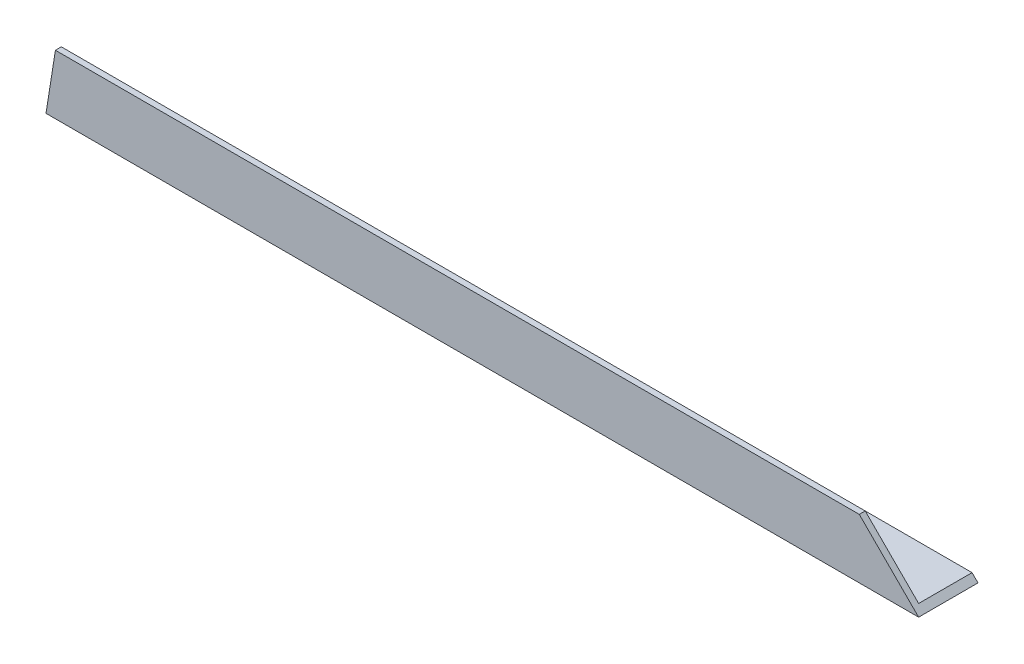
ISO-10303-21;
HEADER;
FILE_DESCRIPTION(('STEP AP214'),'2;1');
FILE_NAME('part.step','',(''),(''),'','','');
FILE_SCHEMA(('AUTOMOTIVE_DESIGN { 1 0 10303 214 1 1 1 1 }'));
ENDSEC;
DATA;
#1=APPLICATION_CONTEXT('core data for automotive mechanical design processes');
#2=APPLICATION_PROTOCOL_DEFINITION('international standard','automotive_design',2000,#1);
#3=PRODUCT_CONTEXT('',#1,'mechanical');
#4=PRODUCT('Part','Part','',(#3));
#5=PRODUCT_RELATED_PRODUCT_CATEGORY('part','',(#4));
#6=PRODUCT_DEFINITION_FORMATION('','',#4);
#7=PRODUCT_DEFINITION_CONTEXT('part definition',#1,'design');
#8=PRODUCT_DEFINITION('design','',#6,#7);
#9=PRODUCT_DEFINITION_SHAPE('','',#8);
#10=(LENGTH_UNIT() NAMED_UNIT(*) SI_UNIT(.MILLI.,.METRE.));
#11=(NAMED_UNIT(*) PLANE_ANGLE_UNIT() SI_UNIT($,.RADIAN.));
#12=(NAMED_UNIT(*) SI_UNIT($,.STERADIAN.) SOLID_ANGLE_UNIT());
#13=UNCERTAINTY_MEASURE_WITH_UNIT(LENGTH_MEASURE(1.E-05),#10,'distance_accuracy_value','');
#14=(GEOMETRIC_REPRESENTATION_CONTEXT(3) GLOBAL_UNCERTAINTY_ASSIGNED_CONTEXT((#13)) GLOBAL_UNIT_ASSIGNED_CONTEXT((#10,
#11,#12)) REPRESENTATION_CONTEXT('',''));
#15=CARTESIAN_POINT('',(0.,0.,0.));
#16=DIRECTION('',(0.,0.,1.));
#17=DIRECTION('',(1.,0.,0.));
#18=AXIS2_PLACEMENT_3D('',#15,#16,#17);
#19=CARTESIAN_POINT('',(294.,20.,0.));
#20=DIRECTION('',(0.,-1.,0.));
#21=DIRECTION('',(0.,0.,-1.));
#22=AXIS2_PLACEMENT_3D('',#19,#20,#21);
#23=PLANE('',#22);
#24=DIRECTION('',(0.,0.,1.));
#25=VECTOR('',#24,1.);
#26=CARTESIAN_POINT('',(3.1676888064906,20.,-20.));
#27=LINE('',#26,#25);
#28=CARTESIAN_POINT('',(3.1676888064906,20.,-2.));
#29=VERTEX_POINT('',#28);
#30=CARTESIAN_POINT('',(3.1676888064906,20.,0.));
#31=VERTEX_POINT('',#30);
#32=EDGE_CURVE('E89',#29,#31,#27,.T.);
#33=ORIENTED_EDGE('',*,*,#32,.T.);
#34=DIRECTION('',(-1.,0.,0.));
#35=VECTOR('',#34,1.);
#36=CARTESIAN_POINT('',(294.,20.,0.));
#37=LINE('',#36,#35);
#38=CARTESIAN_POINT('',(274.,20.,0.));
#39=VERTEX_POINT('',#38);
#40=EDGE_CURVE('E11',#39,#31,#37,.T.);
#41=ORIENTED_EDGE('',*,*,#40,.F.);
#42=DIRECTION('',(0.,0.,1.));
#43=VECTOR('',#42,1.);
#44=CARTESIAN_POINT('',(274.,20.,-20.));
#45=LINE('',#44,#43);
#46=CARTESIAN_POINT('',(274.,20.,-2.));
#47=VERTEX_POINT('',#46);
#48=EDGE_CURVE('E109',#47,#39,#45,.T.);
#49=ORIENTED_EDGE('',*,*,#48,.F.);
#50=DIRECTION('',(-1.,0.,0.));
#51=VECTOR('',#50,1.);
#52=CARTESIAN_POINT('',(294.,20.,-2.));
#53=LINE('',#52,#51);
#54=EDGE_CURVE('E102',#47,#29,#53,.T.);
#55=ORIENTED_EDGE('',*,*,#54,.T.);
#56=EDGE_LOOP('',(#33,#41,#49,#55));
#57=FACE_BOUND('',#56,.T.);
#58=ADVANCED_FACE('F39',(#57),#23,.F.);
#59=CARTESIAN_POINT('',(294.,20.,0.));
#60=DIRECTION('',(0.,0.,-1.));
#61=DIRECTION('',(-1.,0.,0.));
#62=AXIS2_PLACEMENT_3D('',#59,#60,#61);
#63=PLANE('',#62);
#64=DIRECTION('',(-0.156434465040225,-0.987688340595139,0.));
#65=VECTOR('',#64,1.);
#66=CARTESIAN_POINT('',(0.,0.,0.));
#67=LINE('',#66,#65);
#68=CARTESIAN_POINT('',(0.,0.,0.));
#69=VERTEX_POINT('',#68);
#70=EDGE_CURVE('E86',#31,#69,#67,.T.);
#71=ORIENTED_EDGE('',*,*,#70,.T.);
#72=DIRECTION('',(-1.,0.,0.));
#73=VECTOR('',#72,1.);
#74=CARTESIAN_POINT('',(294.,0.,0.));
#75=LINE('',#74,#73);
#76=CARTESIAN_POINT('',(294.,0.,0.));
#77=VERTEX_POINT('',#76);
#78=EDGE_CURVE('E47',#77,#69,#75,.T.);
#79=ORIENTED_EDGE('',*,*,#78,.F.);
#80=DIRECTION('',(-0.707106781186544,0.707106781186551,0.));
#81=VECTOR('',#80,1.);
#82=CARTESIAN_POINT('',(294.,0.,0.));
#83=LINE('',#82,#81);
#84=EDGE_CURVE('E53',#77,#39,#83,.T.);
#85=ORIENTED_EDGE('',*,*,#84,.T.);
#86=ORIENTED_EDGE('',*,*,#40,.T.);
#87=EDGE_LOOP('',(#71,#79,#85,#86));
#88=FACE_BOUND('',#87,.T.);
#89=ADVANCED_FACE('F105',(#88),#63,.F.);
#90=CARTESIAN_POINT('',(294.,0.,-20.));
#91=DIRECTION('',(0.,0.,1.));
#92=DIRECTION('',(1.,0.,0.));
#93=AXIS2_PLACEMENT_3D('',#90,#91,#92);
#94=PLANE('',#93);
#95=DIRECTION('',(-0.156434465040225,-0.987688340595139,0.));
#96=VECTOR('',#95,1.);
#97=CARTESIAN_POINT('',(0.,0.,-20.));
#98=LINE('',#97,#96);
#99=CARTESIAN_POINT('',(0.316768880649068,2.,-20.));
#100=VERTEX_POINT('',#99);
#101=CARTESIAN_POINT('',(0.,0.,-20.));
#102=VERTEX_POINT('',#101);
#103=EDGE_CURVE('E95',#100,#102,#98,.T.);
#104=ORIENTED_EDGE('',*,*,#103,.F.);
#105=DIRECTION('',(-1.,0.,0.));
#106=VECTOR('',#105,1.);
#107=CARTESIAN_POINT('',(294.,2.,-20.));
#108=LINE('',#107,#106);
#109=CARTESIAN_POINT('',(292.,2.,-20.));
#110=VERTEX_POINT('',#109);
#111=EDGE_CURVE('E127',#110,#100,#108,.T.);
#112=ORIENTED_EDGE('',*,*,#111,.F.);
#113=DIRECTION('',(-0.707106781186544,0.707106781186551,0.));
#114=VECTOR('',#113,1.);
#115=CARTESIAN_POINT('',(294.,0.,-20.));
#116=LINE('',#115,#114);
#117=CARTESIAN_POINT('',(294.,0.,-20.));
#118=VERTEX_POINT('',#117);
#119=EDGE_CURVE('E107',#118,#110,#116,.T.);
#120=ORIENTED_EDGE('',*,*,#119,.F.);
#121=DIRECTION('',(-1.,0.,0.));
#122=VECTOR('',#121,1.);
#123=CARTESIAN_POINT('',(294.,0.,-20.));
#124=LINE('',#123,#122);
#125=EDGE_CURVE('E130',#118,#102,#124,.T.);
#126=ORIENTED_EDGE('',*,*,#125,.T.);
#127=EDGE_LOOP('',(#104,#112,#120,#126));
#128=FACE_BOUND('',#127,.T.);
#129=ADVANCED_FACE('F141',(#128),#94,.F.);
#130=CARTESIAN_POINT('',(294.,2.,-20.));
#131=DIRECTION('',(0.,-1.,0.));
#132=DIRECTION('',(0.,0.,-1.));
#133=AXIS2_PLACEMENT_3D('',#130,#131,#132);
#134=PLANE('',#133);
#135=DIRECTION('',(0.,0.,-1.));
#136=VECTOR('',#135,1.);
#137=CARTESIAN_POINT('',(0.316768880649021,2.,-20.));
#138=LINE('',#137,#136);
#139=CARTESIAN_POINT('',(0.316768880649053,2.,-2.));
#140=VERTEX_POINT('',#139);
#141=EDGE_CURVE('E114',#140,#100,#138,.T.);
#142=ORIENTED_EDGE('',*,*,#141,.F.);
#143=DIRECTION('',(-1.,0.,0.));
#144=VECTOR('',#143,1.);
#145=CARTESIAN_POINT('',(294.,2.,-2.));
#146=LINE('',#145,#144);
#147=CARTESIAN_POINT('',(292.,2.,-2.));
#148=VERTEX_POINT('',#147);
#149=EDGE_CURVE('E124',#148,#140,#146,.T.);
#150=ORIENTED_EDGE('',*,*,#149,.F.);
#151=DIRECTION('',(0.,0.,1.));
#152=VECTOR('',#151,1.);
#153=CARTESIAN_POINT('',(292.,2.,-20.));
#154=LINE('',#153,#152);
#155=EDGE_CURVE('E118',#110,#148,#154,.T.);
#156=ORIENTED_EDGE('',*,*,#155,.F.);
#157=ORIENTED_EDGE('',*,*,#111,.T.);
#158=EDGE_LOOP('',(#142,#150,#156,#157));
#159=FACE_BOUND('',#158,.T.);
#160=ADVANCED_FACE('F144',(#159),#134,.F.);
#161=CARTESIAN_POINT('',(294.,2.,-2.));
#162=DIRECTION('',(0.,0.,1.));
#163=DIRECTION('',(0.,-1.,0.));
#164=AXIS2_PLACEMENT_3D('',#161,#162,#163);
#165=PLANE('',#164);
#166=DIRECTION('',(-0.156434465040225,-0.987688340595139,0.));
#167=VECTOR('',#166,1.);
#168=CARTESIAN_POINT('',(7.50370909898679,47.3765546894107,-2.));
#169=LINE('',#168,#167);
#170=EDGE_CURVE('E103',#29,#140,#169,.T.);
#171=ORIENTED_EDGE('',*,*,#170,.F.);
#172=ORIENTED_EDGE('',*,*,#54,.F.);
#173=DIRECTION('',(-0.707106781186544,0.707106781186551,0.));
#174=VECTOR('',#173,1.);
#175=CARTESIAN_POINT('',(293.,1.00000000000001,-2.));
#176=LINE('',#175,#174);
#177=EDGE_CURVE('E116',#148,#47,#176,.T.);
#178=ORIENTED_EDGE('',*,*,#177,.F.);
#179=ORIENTED_EDGE('',*,*,#149,.T.);
#180=EDGE_LOOP('',(#171,#172,#178,#179));
#181=FACE_BOUND('',#180,.T.);
#182=ADVANCED_FACE('F148',(#181),#165,.F.);
#183=CARTESIAN_POINT('',(294.,0.,0.));
#184=DIRECTION('',(0.,1.,0.));
#185=DIRECTION('',(0.,0.,1.));
#186=AXIS2_PLACEMENT_3D('',#183,#184,#185);
#187=PLANE('',#186);
#188=DIRECTION('',(0.,0.,-1.));
#189=VECTOR('',#188,1.);
#190=CARTESIAN_POINT('',(0.,0.,0.));
#191=LINE('',#190,#189);
#192=EDGE_CURVE('E92',#69,#102,#191,.T.);
#193=ORIENTED_EDGE('',*,*,#192,.T.);
#194=ORIENTED_EDGE('',*,*,#125,.F.);
#195=DIRECTION('',(0.,0.,-1.));
#196=VECTOR('',#195,1.);
#197=CARTESIAN_POINT('',(294.,0.,0.));
#198=LINE('',#197,#196);
#199=EDGE_CURVE('E120',#77,#118,#198,.T.);
#200=ORIENTED_EDGE('',*,*,#199,.F.);
#201=ORIENTED_EDGE('',*,*,#78,.T.);
#202=EDGE_LOOP('',(#193,#194,#200,#201));
#203=FACE_BOUND('',#202,.T.);
#204=ADVANCED_FACE('F133',(#203),#187,.F.);
#205=CARTESIAN_POINT('',(0.,0.,-20.));
#206=DIRECTION('',(-0.987688340595139,0.156434465040225,0.));
#207=DIRECTION('',(-0.156434465040225,-0.987688340595139,0.));
#208=AXIS2_PLACEMENT_3D('',#205,#206,#207);
#209=PLANE('',#208);
#210=ORIENTED_EDGE('',*,*,#141,.T.);
#211=ORIENTED_EDGE('',*,*,#103,.T.);
#212=ORIENTED_EDGE('',*,*,#192,.F.);
#213=ORIENTED_EDGE('',*,*,#70,.F.);
#214=ORIENTED_EDGE('',*,*,#32,.F.);
#215=ORIENTED_EDGE('',*,*,#170,.T.);
#216=EDGE_LOOP('',(#210,#211,#212,#213,#214,#215));
#217=FACE_BOUND('',#216,.T.);
#218=ADVANCED_FACE('F88',(#217),#209,.T.);
#219=CARTESIAN_POINT('',(294.,0.,-20.));
#220=DIRECTION('',(0.707106781186551,0.707106781186544,0.));
#221=DIRECTION('',(-0.707106781186544,0.707106781186551,0.));
#222=AXIS2_PLACEMENT_3D('',#219,#220,#221);
#223=PLANE('',#222);
#224=ORIENTED_EDGE('',*,*,#155,.T.);
#225=ORIENTED_EDGE('',*,*,#177,.T.);
#226=ORIENTED_EDGE('',*,*,#48,.T.);
#227=ORIENTED_EDGE('',*,*,#84,.F.);
#228=ORIENTED_EDGE('',*,*,#199,.T.);
#229=ORIENTED_EDGE('',*,*,#119,.T.);
#230=EDGE_LOOP('',(#224,#225,#226,#227,#228,#229));
#231=FACE_BOUND('',#230,.T.);
#232=ADVANCED_FACE('F136',(#231),#223,.T.);
#233=CLOSED_SHELL('',(#58,#89,#129,#160,#182,#204,#218,#232));
#234=MANIFOLD_SOLID_BREP('B2',#233);
#235=ADVANCED_BREP_SHAPE_REPRESENTATION('',(#18,#234),#14);
#236=SHAPE_DEFINITION_REPRESENTATION(#9,#235);
ENDSEC;
END-ISO-10303-21;
